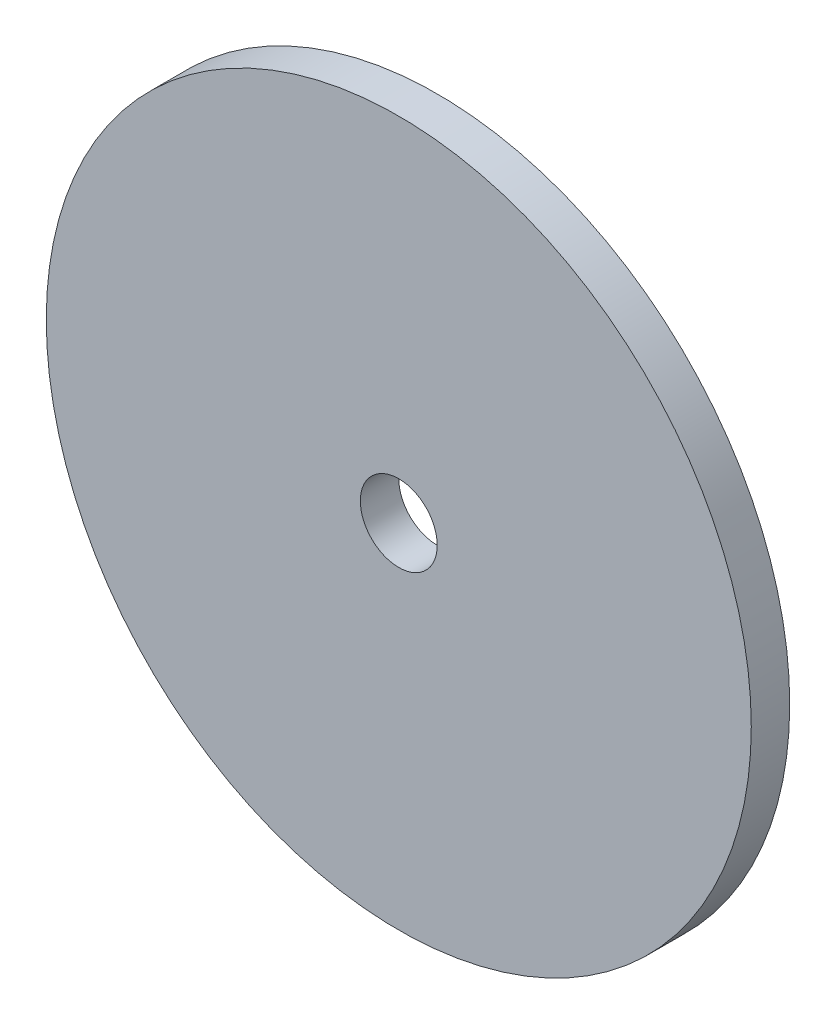
ISO-10303-21;
HEADER;
FILE_DESCRIPTION(('STEP AP214'),'2;1');
FILE_NAME('part.step','',(''),(''),'','','');
FILE_SCHEMA(('AUTOMOTIVE_DESIGN { 1 0 10303 214 1 1 1 1 }'));
ENDSEC;
DATA;
#1=APPLICATION_CONTEXT('core data for automotive mechanical design processes');
#2=APPLICATION_PROTOCOL_DEFINITION('international standard','automotive_design',2000,#1);
#3=PRODUCT_CONTEXT('',#1,'mechanical');
#4=PRODUCT('Part','Part','',(#3));
#5=PRODUCT_RELATED_PRODUCT_CATEGORY('part','',(#4));
#6=PRODUCT_DEFINITION_FORMATION('','',#4);
#7=PRODUCT_DEFINITION_CONTEXT('part definition',#1,'design');
#8=PRODUCT_DEFINITION('design','',#6,#7);
#9=PRODUCT_DEFINITION_SHAPE('','',#8);
#10=(LENGTH_UNIT() NAMED_UNIT(*) SI_UNIT(.MILLI.,.METRE.));
#11=(NAMED_UNIT(*) PLANE_ANGLE_UNIT() SI_UNIT($,.RADIAN.));
#12=(NAMED_UNIT(*) SI_UNIT($,.STERADIAN.) SOLID_ANGLE_UNIT());
#13=UNCERTAINTY_MEASURE_WITH_UNIT(LENGTH_MEASURE(1.E-05),#10,'distance_accuracy_value','');
#14=(GEOMETRIC_REPRESENTATION_CONTEXT(3) GLOBAL_UNCERTAINTY_ASSIGNED_CONTEXT((#13)) GLOBAL_UNIT_ASSIGNED_CONTEXT((#10,
#11,#12)) REPRESENTATION_CONTEXT('',''));
#15=CARTESIAN_POINT('',(0.,0.,0.));
#16=DIRECTION('',(0.,0.,1.));
#17=DIRECTION('',(1.,0.,0.));
#18=AXIS2_PLACEMENT_3D('',#15,#16,#17);
#19=CARTESIAN_POINT('',(0.,0.,6.));
#20=DIRECTION('',(0.,0.,1.));
#21=DIRECTION('',(1.,0.,0.));
#22=AXIS2_PLACEMENT_3D('',#19,#20,#21);
#23=PLANE('',#22);
#24=CARTESIAN_POINT('',(0.,0.,6.));
#25=DIRECTION('',(0.,0.,1.));
#26=DIRECTION('',(1.,0.,0.));
#27=AXIS2_PLACEMENT_3D('',#24,#25,#26);
#28=CIRCLE('',#27,55.);
#29=CARTESIAN_POINT('',(55.,0.,6.));
#30=VERTEX_POINT('',#29);
#31=EDGE_CURVE('E10',#30,#30,#28,.T.);
#32=ORIENTED_EDGE('',*,*,#31,.T.);
#33=EDGE_LOOP('',(#32));
#34=FACE_BOUND('',#33,.T.);
#35=CARTESIAN_POINT('',(0.,0.,6.));
#36=DIRECTION('',(0.,0.,1.));
#37=DIRECTION('',(1.,0.,0.));
#38=AXIS2_PLACEMENT_3D('',#35,#36,#37);
#39=CIRCLE('',#38,6.);
#40=CARTESIAN_POINT('',(6.,0.,6.));
#41=VERTEX_POINT('',#40);
#42=EDGE_CURVE('E42',#41,#41,#39,.T.);
#43=ORIENTED_EDGE('',*,*,#42,.F.);
#44=EDGE_LOOP('',(#43));
#45=FACE_BOUND('',#44,.T.);
#46=ADVANCED_FACE('F31',(#34,#45),#23,.T.);
#47=CARTESIAN_POINT('',(0.,0.,0.));
#48=DIRECTION('',(0.,0.,1.));
#49=DIRECTION('',(1.,0.,0.));
#50=AXIS2_PLACEMENT_3D('',#47,#48,#49);
#51=PLANE('',#50);
#52=CARTESIAN_POINT('',(0.,0.,0.));
#53=DIRECTION('',(0.,0.,1.));
#54=DIRECTION('',(1.,0.,0.));
#55=AXIS2_PLACEMENT_3D('',#52,#53,#54);
#56=CIRCLE('',#55,55.);
#57=CARTESIAN_POINT('',(55.,0.,0.));
#58=VERTEX_POINT('',#57);
#59=EDGE_CURVE('E35',#58,#58,#56,.T.);
#60=ORIENTED_EDGE('',*,*,#59,.F.);
#61=EDGE_LOOP('',(#60));
#62=FACE_BOUND('',#61,.T.);
#63=CARTESIAN_POINT('',(0.,0.,0.));
#64=DIRECTION('',(0.,0.,1.));
#65=DIRECTION('',(1.,0.,0.));
#66=AXIS2_PLACEMENT_3D('',#63,#64,#65);
#67=CIRCLE('',#66,6.);
#68=CARTESIAN_POINT('',(6.,0.,0.));
#69=VERTEX_POINT('',#68);
#70=EDGE_CURVE('E44',#69,#69,#67,.T.);
#71=ORIENTED_EDGE('',*,*,#70,.T.);
#72=EDGE_LOOP('',(#71));
#73=FACE_BOUND('',#72,.T.);
#74=ADVANCED_FACE('F54',(#62,#73),#51,.F.);
#75=CARTESIAN_POINT('',(0.,0.,6.));
#76=DIRECTION('',(0.,0.,-1.));
#77=DIRECTION('',(-1.,0.,0.));
#78=AXIS2_PLACEMENT_3D('',#75,#76,#77);
#79=CYLINDRICAL_SURFACE('',#78,55.);
#80=ORIENTED_EDGE('',*,*,#31,.F.);
#81=EDGE_LOOP('',(#80));
#82=FACE_BOUND('',#81,.T.);
#83=ORIENTED_EDGE('',*,*,#59,.T.);
#84=EDGE_LOOP('',(#83));
#85=FACE_BOUND('',#84,.T.);
#86=ADVANCED_FACE('F33',(#82,#85),#79,.T.);
#87=CARTESIAN_POINT('',(0.,0.,6.));
#88=DIRECTION('',(0.,0.,-1.));
#89=DIRECTION('',(-1.,0.,0.));
#90=AXIS2_PLACEMENT_3D('',#87,#88,#89);
#91=CYLINDRICAL_SURFACE('',#90,6.);
#92=ORIENTED_EDGE('',*,*,#42,.T.);
#93=EDGE_LOOP('',(#92));
#94=FACE_BOUND('',#93,.T.);
#95=ORIENTED_EDGE('',*,*,#70,.F.);
#96=EDGE_LOOP('',(#95));
#97=FACE_BOUND('',#96,.T.);
#98=ADVANCED_FACE('F50',(#94,#97),#91,.F.);
#99=CLOSED_SHELL('',(#46,#74,#86,#98));
#100=MANIFOLD_SOLID_BREP('B2',#99);
#101=ADVANCED_BREP_SHAPE_REPRESENTATION('',(#18,#100),#14);
#102=SHAPE_DEFINITION_REPRESENTATION(#9,#101);
ENDSEC;
END-ISO-10303-21;
